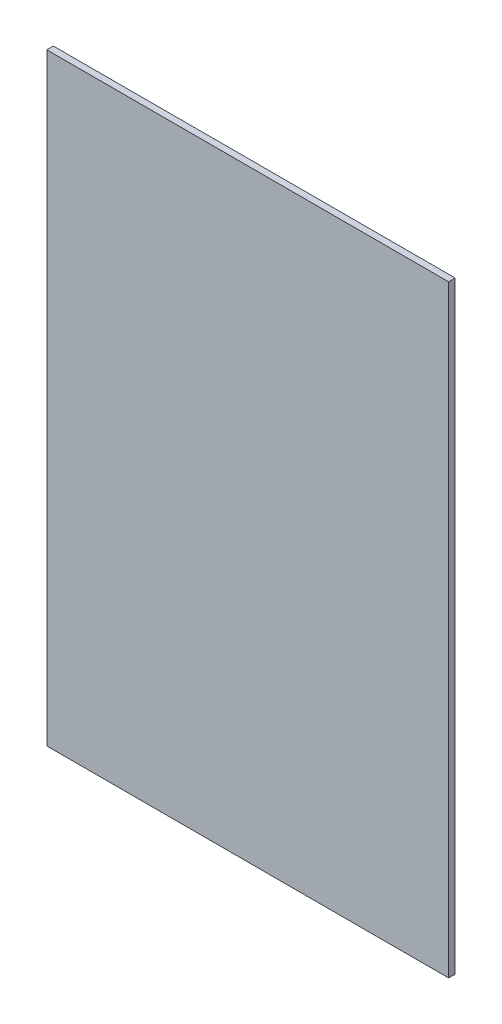
ISO-10303-21;
HEADER;
FILE_DESCRIPTION(('STEP AP214'),'2;1');
FILE_NAME('part.step','',(''),(''),'','','');
FILE_SCHEMA(('AUTOMOTIVE_DESIGN { 1 0 10303 214 1 1 1 1 }'));
ENDSEC;
DATA;
#1=APPLICATION_CONTEXT('core data for automotive mechanical design processes');
#2=APPLICATION_PROTOCOL_DEFINITION('international standard','automotive_design',2000,#1);
#3=PRODUCT_CONTEXT('',#1,'mechanical');
#4=PRODUCT('Part','Part','',(#3));
#5=PRODUCT_RELATED_PRODUCT_CATEGORY('part','',(#4));
#6=PRODUCT_DEFINITION_FORMATION('','',#4);
#7=PRODUCT_DEFINITION_CONTEXT('part definition',#1,'design');
#8=PRODUCT_DEFINITION('design','',#6,#7);
#9=PRODUCT_DEFINITION_SHAPE('','',#8);
#10=(LENGTH_UNIT() NAMED_UNIT(*) SI_UNIT(.MILLI.,.METRE.));
#11=(NAMED_UNIT(*) PLANE_ANGLE_UNIT() SI_UNIT($,.RADIAN.));
#12=(NAMED_UNIT(*) SI_UNIT($,.STERADIAN.) SOLID_ANGLE_UNIT());
#13=UNCERTAINTY_MEASURE_WITH_UNIT(LENGTH_MEASURE(1.E-05),#10,'distance_accuracy_value','');
#14=(GEOMETRIC_REPRESENTATION_CONTEXT(3) GLOBAL_UNCERTAINTY_ASSIGNED_CONTEXT((#13)) GLOBAL_UNIT_ASSIGNED_CONTEXT((#10,
#11,#12)) REPRESENTATION_CONTEXT('',''));
#15=CARTESIAN_POINT('',(0.,0.,0.));
#16=DIRECTION('',(0.,0.,1.));
#17=DIRECTION('',(1.,0.,0.));
#18=AXIS2_PLACEMENT_3D('',#15,#16,#17);
#19=CARTESIAN_POINT('',(0.,0.,4.7625));
#20=DIRECTION('',(1.,0.,0.));
#21=DIRECTION('',(0.,1.,0.));
#22=AXIS2_PLACEMENT_3D('',#19,#20,#21);
#23=PLANE('',#22);
#24=DIRECTION('',(0.,-1.,0.));
#25=VECTOR('',#24,1.);
#26=CARTESIAN_POINT('',(0.,0.,0.));
#27=LINE('',#26,#25);
#28=CARTESIAN_POINT('',(0.,0.,0.));
#29=VERTEX_POINT('',#28);
#30=CARTESIAN_POINT('',(0.,-438.15,0.));
#31=VERTEX_POINT('',#30);
#32=EDGE_CURVE('E102',#29,#31,#27,.T.);
#33=ORIENTED_EDGE('',*,*,#32,.T.);
#34=DIRECTION('',(0.,0.,-1.));
#35=VECTOR('',#34,1.);
#36=CARTESIAN_POINT('',(0.,-438.15,4.7625));
#37=LINE('',#36,#35);
#38=CARTESIAN_POINT('',(0.,-438.15,4.7625));
#39=VERTEX_POINT('',#38);
#40=EDGE_CURVE('E11',#39,#31,#37,.T.);
#41=ORIENTED_EDGE('',*,*,#40,.F.);
#42=DIRECTION('',(0.,-1.,0.));
#43=VECTOR('',#42,1.);
#44=CARTESIAN_POINT('',(0.,0.,4.7625));
#45=LINE('',#44,#43);
#46=CARTESIAN_POINT('',(0.,0.,4.7625));
#47=VERTEX_POINT('',#46);
#48=EDGE_CURVE('E90',#47,#39,#45,.T.);
#49=ORIENTED_EDGE('',*,*,#48,.F.);
#50=DIRECTION('',(0.,0.,-1.));
#51=VECTOR('',#50,1.);
#52=CARTESIAN_POINT('',(0.,0.,4.7625));
#53=LINE('',#52,#51);
#54=EDGE_CURVE('E98',#47,#29,#53,.T.);
#55=ORIENTED_EDGE('',*,*,#54,.T.);
#56=EDGE_LOOP('',(#33,#41,#49,#55));
#57=FACE_BOUND('',#56,.T.);
#58=ADVANCED_FACE('F39',(#57),#23,.F.);
#59=CARTESIAN_POINT('',(0.,-438.15,4.7625));
#60=DIRECTION('',(0.,1.,0.));
#61=DIRECTION('',(0.,0.,1.));
#62=AXIS2_PLACEMENT_3D('',#59,#60,#61);
#63=PLANE('',#62);
#64=DIRECTION('',(1.,0.,0.));
#65=VECTOR('',#64,1.);
#66=CARTESIAN_POINT('',(0.,-438.15,0.));
#67=LINE('',#66,#65);
#68=CARTESIAN_POINT('',(292.1,-438.15,0.));
#69=VERTEX_POINT('',#68);
#70=EDGE_CURVE('E94',#31,#69,#67,.T.);
#71=ORIENTED_EDGE('',*,*,#70,.T.);
#72=DIRECTION('',(0.,0.,-1.));
#73=VECTOR('',#72,1.);
#74=CARTESIAN_POINT('',(292.1,-438.15,4.7625));
#75=LINE('',#74,#73);
#76=CARTESIAN_POINT('',(292.1,-438.15,4.7625));
#77=VERTEX_POINT('',#76);
#78=EDGE_CURVE('E47',#77,#69,#75,.T.);
#79=ORIENTED_EDGE('',*,*,#78,.F.);
#80=DIRECTION('',(1.,0.,0.));
#81=VECTOR('',#80,1.);
#82=CARTESIAN_POINT('',(0.,-438.15,4.7625));
#83=LINE('',#82,#81);
#84=EDGE_CURVE('E85',#39,#77,#83,.T.);
#85=ORIENTED_EDGE('',*,*,#84,.F.);
#86=ORIENTED_EDGE('',*,*,#40,.T.);
#87=EDGE_LOOP('',(#71,#79,#85,#86));
#88=FACE_BOUND('',#87,.T.);
#89=ADVANCED_FACE('F93',(#88),#63,.F.);
#90=CARTESIAN_POINT('',(292.1,0.,4.7625));
#91=DIRECTION('',(-1.,0.,0.));
#92=DIRECTION('',(0.,-1.,0.));
#93=AXIS2_PLACEMENT_3D('',#90,#91,#92);
#94=PLANE('',#93);
#95=DIRECTION('',(0.,1.,0.));
#96=VECTOR('',#95,1.);
#97=CARTESIAN_POINT('',(292.1,0.,0.));
#98=LINE('',#97,#96);
#99=CARTESIAN_POINT('',(292.1,0.,0.));
#100=VERTEX_POINT('',#99);
#101=EDGE_CURVE('E72',#69,#100,#98,.T.);
#102=ORIENTED_EDGE('',*,*,#101,.T.);
#103=DIRECTION('',(0.,0.,-1.));
#104=VECTOR('',#103,1.);
#105=CARTESIAN_POINT('',(292.1,0.,4.7625));
#106=LINE('',#105,#104);
#107=CARTESIAN_POINT('',(292.1,0.,4.7625));
#108=VERTEX_POINT('',#107);
#109=EDGE_CURVE('E95',#108,#100,#106,.T.);
#110=ORIENTED_EDGE('',*,*,#109,.F.);
#111=DIRECTION('',(0.,1.,0.));
#112=VECTOR('',#111,1.);
#113=CARTESIAN_POINT('',(292.1,0.,4.7625));
#114=LINE('',#113,#112);
#115=EDGE_CURVE('E88',#77,#108,#114,.T.);
#116=ORIENTED_EDGE('',*,*,#115,.F.);
#117=ORIENTED_EDGE('',*,*,#78,.T.);
#118=EDGE_LOOP('',(#102,#110,#116,#117));
#119=FACE_BOUND('',#118,.T.);
#120=ADVANCED_FACE('F96',(#119),#94,.F.);
#121=CARTESIAN_POINT('',(0.,0.,4.7625));
#122=DIRECTION('',(0.,-1.,0.));
#123=DIRECTION('',(0.,0.,-1.));
#124=AXIS2_PLACEMENT_3D('',#121,#122,#123);
#125=PLANE('',#124);
#126=DIRECTION('',(-1.,0.,0.));
#127=VECTOR('',#126,1.);
#128=CARTESIAN_POINT('',(0.,0.,0.));
#129=LINE('',#128,#127);
#130=EDGE_CURVE('E78',#100,#29,#129,.T.);
#131=ORIENTED_EDGE('',*,*,#130,.T.);
#132=ORIENTED_EDGE('',*,*,#54,.F.);
#133=DIRECTION('',(-1.,0.,0.));
#134=VECTOR('',#133,1.);
#135=CARTESIAN_POINT('',(0.,0.,4.7625));
#136=LINE('',#135,#134);
#137=EDGE_CURVE('E55',#108,#47,#136,.T.);
#138=ORIENTED_EDGE('',*,*,#137,.F.);
#139=ORIENTED_EDGE('',*,*,#109,.T.);
#140=EDGE_LOOP('',(#131,#132,#138,#139));
#141=FACE_BOUND('',#140,.T.);
#142=ADVANCED_FACE('F109',(#141),#125,.F.);
#143=CARTESIAN_POINT('',(0.,0.,4.7625));
#144=DIRECTION('',(0.,0.,1.));
#145=DIRECTION('',(1.,0.,0.));
#146=AXIS2_PLACEMENT_3D('',#143,#144,#145);
#147=PLANE('',#146);
#148=ORIENTED_EDGE('',*,*,#48,.T.);
#149=ORIENTED_EDGE('',*,*,#84,.T.);
#150=ORIENTED_EDGE('',*,*,#115,.T.);
#151=ORIENTED_EDGE('',*,*,#137,.T.);
#152=EDGE_LOOP('',(#148,#149,#150,#151));
#153=FACE_BOUND('',#152,.T.);
#154=ADVANCED_FACE('F86',(#153),#147,.T.);
#155=CARTESIAN_POINT('',(0.,0.,0.));
#156=DIRECTION('',(0.,0.,1.));
#157=DIRECTION('',(1.,0.,0.));
#158=AXIS2_PLACEMENT_3D('',#155,#156,#157);
#159=PLANE('',#158);
#160=ORIENTED_EDGE('',*,*,#32,.F.);
#161=ORIENTED_EDGE('',*,*,#130,.F.);
#162=ORIENTED_EDGE('',*,*,#101,.F.);
#163=ORIENTED_EDGE('',*,*,#70,.F.);
#164=EDGE_LOOP('',(#160,#161,#162,#163));
#165=FACE_BOUND('',#164,.T.);
#166=ADVANCED_FACE('F112',(#165),#159,.F.);
#167=CLOSED_SHELL('',(#58,#89,#120,#142,#154,#166));
#168=MANIFOLD_SOLID_BREP('B2',#167);
#169=ADVANCED_BREP_SHAPE_REPRESENTATION('',(#18,#168),#14);
#170=SHAPE_DEFINITION_REPRESENTATION(#9,#169);
ENDSEC;
END-ISO-10303-21;
